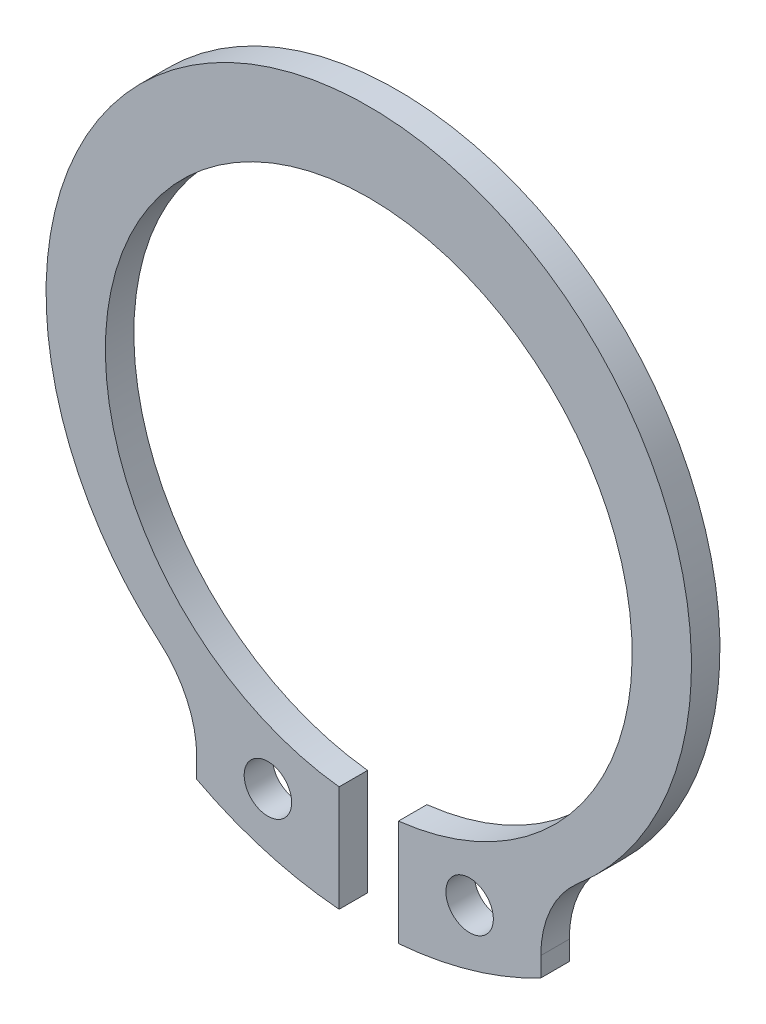
ISO-10303-21;
HEADER;
FILE_DESCRIPTION(('STEP AP214'),'2;1');
FILE_NAME('part.step','',(''),(''),'','','');
FILE_SCHEMA(('AUTOMOTIVE_DESIGN { 1 0 10303 214 1 1 1 1 }'));
ENDSEC;
DATA;
#1=APPLICATION_CONTEXT('core data for automotive mechanical design processes');
#2=APPLICATION_PROTOCOL_DEFINITION('international standard','automotive_design',2000,#1);
#3=PRODUCT_CONTEXT('',#1,'mechanical');
#4=PRODUCT('Part','Part','',(#3));
#5=PRODUCT_RELATED_PRODUCT_CATEGORY('part','',(#4));
#6=PRODUCT_DEFINITION_FORMATION('','',#4);
#7=PRODUCT_DEFINITION_CONTEXT('part definition',#1,'design');
#8=PRODUCT_DEFINITION('design','',#6,#7);
#9=PRODUCT_DEFINITION_SHAPE('','',#8);
#10=(LENGTH_UNIT() NAMED_UNIT(*) SI_UNIT(.MILLI.,.METRE.));
#11=(NAMED_UNIT(*) PLANE_ANGLE_UNIT() SI_UNIT($,.RADIAN.));
#12=(NAMED_UNIT(*) SI_UNIT($,.STERADIAN.) SOLID_ANGLE_UNIT());
#13=UNCERTAINTY_MEASURE_WITH_UNIT(LENGTH_MEASURE(1.E-05),#10,'distance_accuracy_value','');
#14=(GEOMETRIC_REPRESENTATION_CONTEXT(3) GLOBAL_UNCERTAINTY_ASSIGNED_CONTEXT((#13)) GLOBAL_UNIT_ASSIGNED_CONTEXT((#10,
#11,#12)) REPRESENTATION_CONTEXT('',''));
#15=CARTESIAN_POINT('',(0.,0.,0.));
#16=DIRECTION('',(0.,0.,1.));
#17=DIRECTION('',(1.,0.,0.));
#18=AXIS2_PLACEMENT_3D('',#15,#16,#17);
#19=CARTESIAN_POINT('',(0.,0.,-1.2));
#20=DIRECTION('',(0.,0.,1.));
#21=DIRECTION('',(1.,0.,0.));
#22=AXIS2_PLACEMENT_3D('',#19,#20,#21);
#23=CYLINDRICAL_SURFACE('',#22,13.6);
#24=CARTESIAN_POINT('',(0.,0.,-1.2));
#25=DIRECTION('',(0.,0.,1.));
#26=DIRECTION('',(1.,0.,0.));
#27=AXIS2_PLACEMENT_3D('',#24,#25,#26);
#28=CIRCLE('',#27,13.6);
#29=CARTESIAN_POINT('',(8.82872928176796,-10.3447348573684,-1.2));
#30=VERTEX_POINT('',#29);
#31=CARTESIAN_POINT('',(-8.82872928176796,-10.3447348573684,-1.2));
#32=VERTEX_POINT('',#31);
#33=EDGE_CURVE('E119',#30,#32,#28,.T.);
#34=ORIENTED_EDGE('',*,*,#33,.T.);
#35=DIRECTION('',(0.,0.,1.));
#36=VECTOR('',#35,1.);
#37=CARTESIAN_POINT('',(-8.82872928176796,-10.3447348573684,-1.2));
#38=LINE('',#37,#36);
#39=CARTESIAN_POINT('',(-8.82872928176796,-10.3447348573684,0.));
#40=VERTEX_POINT('',#39);
#41=EDGE_CURVE('E181',#32,#40,#38,.T.);
#42=ORIENTED_EDGE('',*,*,#41,.T.);
#43=CARTESIAN_POINT('',(0.,0.,0.));
#44=DIRECTION('',(0.,0.,1.));
#45=DIRECTION('',(1.,0.,0.));
#46=AXIS2_PLACEMENT_3D('',#43,#44,#45);
#47=CIRCLE('',#46,13.6);
#48=CARTESIAN_POINT('',(8.82872928176796,-10.3447348573684,0.));
#49=VERTEX_POINT('',#48);
#50=EDGE_CURVE('E148',#49,#40,#47,.T.);
#51=ORIENTED_EDGE('',*,*,#50,.F.);
#52=DIRECTION('',(0.,0.,1.));
#53=VECTOR('',#52,1.);
#54=CARTESIAN_POINT('',(8.82872928176796,-10.3447348573684,-1.2));
#55=LINE('',#54,#53);
#56=EDGE_CURVE('E172',#49,#30,#55,.F.);
#57=ORIENTED_EDGE('',*,*,#56,.T.);
#58=EDGE_LOOP('',(#34,#42,#51,#57));
#59=FACE_BOUND('',#58,.T.);
#60=ADVANCED_FACE('F31',(#59),#23,.T.);
#61=CARTESIAN_POINT('',(7.25,-11.5064112563388,-1.2));
#62=DIRECTION('',(1.,0.,0.));
#63=DIRECTION('',(0.,1.,0.));
#64=AXIS2_PLACEMENT_3D('',#61,#62,#63);
#65=PLANE('',#64);
#66=DIRECTION('',(0.,1.,0.));
#67=VECTOR('',#66,1.);
#68=CARTESIAN_POINT('',(7.25,-11.5064112563388,-1.2));
#69=LINE('',#68,#67);
#70=CARTESIAN_POINT('',(7.25000000000001,-14.5864530312141,-1.2));
#71=VERTEX_POINT('',#70);
#72=CARTESIAN_POINT('',(7.25,-13.7676250675271,-1.2));
#73=VERTEX_POINT('',#72);
#74=EDGE_CURVE('E127',#71,#73,#69,.T.);
#75=ORIENTED_EDGE('',*,*,#74,.T.);
#76=DIRECTION('',(0.,0.,-1.));
#77=VECTOR('',#76,1.);
#78=CARTESIAN_POINT('',(7.25,-13.7676250675271,0.));
#79=LINE('',#78,#77);
#80=CARTESIAN_POINT('',(7.25,-13.7676250675271,0.));
#81=VERTEX_POINT('',#80);
#82=EDGE_CURVE('E185',#73,#81,#79,.F.);
#83=ORIENTED_EDGE('',*,*,#82,.T.);
#84=DIRECTION('',(0.,1.,0.));
#85=VECTOR('',#84,1.);
#86=CARTESIAN_POINT('',(7.25,-11.5064112563388,0.));
#87=LINE('',#86,#85);
#88=CARTESIAN_POINT('',(7.25000000000001,-14.5864530312141,0.));
#89=VERTEX_POINT('',#88);
#90=EDGE_CURVE('E167',#89,#81,#87,.T.);
#91=ORIENTED_EDGE('',*,*,#90,.F.);
#92=DIRECTION('',(0.,0.,1.));
#93=VECTOR('',#92,1.);
#94=CARTESIAN_POINT('',(7.25000000000001,-14.5864530312141,-1.2));
#95=LINE('',#94,#93);
#96=EDGE_CURVE('E170',#71,#89,#95,.T.);
#97=ORIENTED_EDGE('',*,*,#96,.F.);
#98=EDGE_LOOP('',(#75,#83,#91,#97));
#99=FACE_BOUND('',#98,.T.);
#100=ADVANCED_FACE('F198',(#99),#65,.T.);
#101=CARTESIAN_POINT('',(0.,-0.83,-1.2));
#102=DIRECTION('',(0.,0.,1.));
#103=DIRECTION('',(1.,0.,0.));
#104=AXIS2_PLACEMENT_3D('',#101,#102,#103);
#105=CYLINDRICAL_SURFACE('',#104,15.55);
#106=CARTESIAN_POINT('',(0.,-0.83,0.));
#107=DIRECTION('',(0.,0.,1.));
#108=DIRECTION('',(-1.,0.,0.));
#109=AXIS2_PLACEMENT_3D('',#106,#107,#108);
#110=CIRCLE('',#109,15.55);
#111=CARTESIAN_POINT('',(1.25,-16.3296774159981,0.));
#112=VERTEX_POINT('',#111);
#113=EDGE_CURVE('E164',#112,#89,#110,.T.);
#114=ORIENTED_EDGE('',*,*,#113,.F.);
#115=DIRECTION('',(0.,0.,1.));
#116=VECTOR('',#115,1.);
#117=CARTESIAN_POINT('',(1.25,-16.3296774159981,-1.2));
#118=LINE('',#117,#116);
#119=CARTESIAN_POINT('',(1.25,-16.3296774159981,-1.2));
#120=VERTEX_POINT('',#119);
#121=EDGE_CURVE('E173',#120,#112,#118,.T.);
#122=ORIENTED_EDGE('',*,*,#121,.F.);
#123=CARTESIAN_POINT('',(0.,-0.83,-1.2));
#124=DIRECTION('',(0.,0.,1.));
#125=DIRECTION('',(-1.,0.,0.));
#126=AXIS2_PLACEMENT_3D('',#123,#124,#125);
#127=CIRCLE('',#126,15.55);
#128=EDGE_CURVE('E144',#120,#71,#127,.T.);
#129=ORIENTED_EDGE('',*,*,#128,.T.);
#130=ORIENTED_EDGE('',*,*,#96,.T.);
#131=EDGE_LOOP('',(#114,#122,#129,#130));
#132=FACE_BOUND('',#131,.T.);
#133=ADVANCED_FACE('F253',(#132),#105,.T.);
#134=CARTESIAN_POINT('',(1.25,-16.3296774159981,-1.2));
#135=DIRECTION('',(-1.,0.,0.));
#136=DIRECTION('',(0.,-1.,0.));
#137=AXIS2_PLACEMENT_3D('',#134,#135,#136);
#138=PLANE('',#137);
#139=DIRECTION('',(0.,-1.,0.));
#140=VECTOR('',#139,1.);
#141=CARTESIAN_POINT('',(1.25,-16.3296774159981,0.));
#142=LINE('',#141,#140);
#143=CARTESIAN_POINT('',(1.24999999999999,-11.8593925490029,0.));
#144=VERTEX_POINT('',#143);
#145=EDGE_CURVE('E161',#144,#112,#142,.T.);
#146=ORIENTED_EDGE('',*,*,#145,.F.);
#147=DIRECTION('',(0.,0.,1.));
#148=VECTOR('',#147,1.);
#149=CARTESIAN_POINT('',(1.24999999999999,-11.8593925490029,-1.2));
#150=LINE('',#149,#148);
#151=CARTESIAN_POINT('',(1.24999999999999,-11.8593925490029,-1.2));
#152=VERTEX_POINT('',#151);
#153=EDGE_CURVE('E175',#152,#144,#150,.T.);
#154=ORIENTED_EDGE('',*,*,#153,.F.);
#155=DIRECTION('',(0.,-1.,0.));
#156=VECTOR('',#155,1.);
#157=CARTESIAN_POINT('',(1.25,-16.3296774159981,-1.2));
#158=LINE('',#157,#156);
#159=EDGE_CURVE('E141',#152,#120,#158,.T.);
#160=ORIENTED_EDGE('',*,*,#159,.T.);
#161=ORIENTED_EDGE('',*,*,#121,.T.);
#162=EDGE_LOOP('',(#146,#154,#160,#161));
#163=FACE_BOUND('',#162,.T.);
#164=ADVANCED_FACE('F204',(#163),#138,.T.);
#165=CARTESIAN_POINT('',(0.,-0.83,-1.2));
#166=DIRECTION('',(0.,0.,1.));
#167=DIRECTION('',(1.,0.,0.));
#168=AXIS2_PLACEMENT_3D('',#165,#166,#167);
#169=CYLINDRICAL_SURFACE('',#168,11.1);
#170=CARTESIAN_POINT('',(0.,-0.83,0.));
#171=DIRECTION('',(0.,0.,-1.));
#172=DIRECTION('',(1.,0.,0.));
#173=AXIS2_PLACEMENT_3D('',#170,#171,#172);
#174=CIRCLE('',#173,11.1);
#175=CARTESIAN_POINT('',(-1.24999999999999,-11.8593925490029,0.));
#176=VERTEX_POINT('',#175);
#177=EDGE_CURVE('E158',#176,#144,#174,.T.);
#178=ORIENTED_EDGE('',*,*,#177,.F.);
#179=DIRECTION('',(0.,0.,1.));
#180=VECTOR('',#179,1.);
#181=CARTESIAN_POINT('',(-1.24999999999999,-11.8593925490029,-1.2));
#182=LINE('',#181,#180);
#183=CARTESIAN_POINT('',(-1.24999999999999,-11.8593925490029,-1.2));
#184=VERTEX_POINT('',#183);
#185=EDGE_CURVE('E177',#184,#176,#182,.T.);
#186=ORIENTED_EDGE('',*,*,#185,.F.);
#187=CARTESIAN_POINT('',(0.,-0.83,-1.2));
#188=DIRECTION('',(0.,0.,-1.));
#189=DIRECTION('',(1.,0.,0.));
#190=AXIS2_PLACEMENT_3D('',#187,#188,#189);
#191=CIRCLE('',#190,11.1);
#192=EDGE_CURVE('E135',#184,#152,#191,.T.);
#193=ORIENTED_EDGE('',*,*,#192,.T.);
#194=ORIENTED_EDGE('',*,*,#153,.T.);
#195=EDGE_LOOP('',(#178,#186,#193,#194));
#196=FACE_BOUND('',#195,.T.);
#197=ADVANCED_FACE('F208',(#196),#169,.F.);
#198=CARTESIAN_POINT('',(-1.24999999999999,-16.3296774159981,-1.2));
#199=DIRECTION('',(1.,0.,0.));
#200=DIRECTION('',(0.,0.,-1.));
#201=AXIS2_PLACEMENT_3D('',#198,#199,#200);
#202=PLANE('',#201);
#203=DIRECTION('',(0.,1.,0.));
#204=VECTOR('',#203,1.);
#205=CARTESIAN_POINT('',(-1.24999999999999,-16.3296774159981,0.));
#206=LINE('',#205,#204);
#207=CARTESIAN_POINT('',(-1.25,-16.3296774159981,0.));
#208=VERTEX_POINT('',#207);
#209=EDGE_CURVE('E155',#208,#176,#206,.T.);
#210=ORIENTED_EDGE('',*,*,#209,.F.);
#211=DIRECTION('',(0.,0.,1.));
#212=VECTOR('',#211,1.);
#213=CARTESIAN_POINT('',(-1.25,-16.3296774159981,-1.2));
#214=LINE('',#213,#212);
#215=CARTESIAN_POINT('',(-1.25,-16.3296774159981,-1.2));
#216=VERTEX_POINT('',#215);
#217=EDGE_CURVE('E126',#216,#208,#214,.T.);
#218=ORIENTED_EDGE('',*,*,#217,.F.);
#219=DIRECTION('',(0.,1.,0.));
#220=VECTOR('',#219,1.);
#221=CARTESIAN_POINT('',(-1.24999999999999,-16.3296774159981,-1.2));
#222=LINE('',#221,#220);
#223=EDGE_CURVE('E133',#216,#184,#222,.T.);
#224=ORIENTED_EDGE('',*,*,#223,.T.);
#225=ORIENTED_EDGE('',*,*,#185,.T.);
#226=EDGE_LOOP('',(#210,#218,#224,#225));
#227=FACE_BOUND('',#226,.T.);
#228=ADVANCED_FACE('F211',(#227),#202,.T.);
#229=CARTESIAN_POINT('',(0.,-0.83,-1.2));
#230=DIRECTION('',(0.,0.,1.));
#231=DIRECTION('',(1.,0.,0.));
#232=AXIS2_PLACEMENT_3D('',#229,#230,#231);
#233=CYLINDRICAL_SURFACE('',#232,15.55);
#234=CARTESIAN_POINT('',(0.,-0.83,0.));
#235=DIRECTION('',(0.,0.,1.));
#236=DIRECTION('',(1.,0.,0.));
#237=AXIS2_PLACEMENT_3D('',#234,#235,#236);
#238=CIRCLE('',#237,15.55);
#239=CARTESIAN_POINT('',(-7.25,-14.5864530312141,0.));
#240=VERTEX_POINT('',#239);
#241=EDGE_CURVE('E125',#240,#208,#238,.T.);
#242=ORIENTED_EDGE('',*,*,#241,.F.);
#243=DIRECTION('',(0.,0.,1.));
#244=VECTOR('',#243,1.);
#245=CARTESIAN_POINT('',(-7.25,-14.5864530312141,-1.2));
#246=LINE('',#245,#244);
#247=CARTESIAN_POINT('',(-7.25,-14.5864530312141,-1.2));
#248=VERTEX_POINT('',#247);
#249=EDGE_CURVE('E112',#248,#240,#246,.T.);
#250=ORIENTED_EDGE('',*,*,#249,.F.);
#251=CARTESIAN_POINT('',(0.,-0.83,-1.2));
#252=DIRECTION('',(0.,0.,1.));
#253=DIRECTION('',(1.,0.,0.));
#254=AXIS2_PLACEMENT_3D('',#251,#252,#253);
#255=CIRCLE('',#254,15.55);
#256=EDGE_CURVE('E118',#248,#216,#255,.T.);
#257=ORIENTED_EDGE('',*,*,#256,.T.);
#258=ORIENTED_EDGE('',*,*,#217,.T.);
#259=EDGE_LOOP('',(#242,#250,#257,#258));
#260=FACE_BOUND('',#259,.T.);
#261=ADVANCED_FACE('F123',(#260),#233,.T.);
#262=CARTESIAN_POINT('',(-7.25,-11.5064112563388,-1.2));
#263=DIRECTION('',(-1.,0.,0.));
#264=DIRECTION('',(0.,-1.,0.));
#265=AXIS2_PLACEMENT_3D('',#262,#263,#264);
#266=PLANE('',#265);
#267=DIRECTION('',(0.,-1.,0.));
#268=VECTOR('',#267,1.);
#269=CARTESIAN_POINT('',(-7.25,-11.5064112563388,0.));
#270=LINE('',#269,#268);
#271=CARTESIAN_POINT('',(-7.25,-13.7676250675271,0.));
#272=VERTEX_POINT('',#271);
#273=EDGE_CURVE('E151',#272,#240,#270,.T.);
#274=ORIENTED_EDGE('',*,*,#273,.F.);
#275=DIRECTION('',(0.,0.,-1.));
#276=VECTOR('',#275,1.);
#277=CARTESIAN_POINT('',(-7.25,-13.7676250675271,-1.2));
#278=LINE('',#277,#276);
#279=CARTESIAN_POINT('',(-7.25,-13.7676250675271,-1.2));
#280=VERTEX_POINT('',#279);
#281=EDGE_CURVE('E115',#272,#280,#278,.T.);
#282=ORIENTED_EDGE('',*,*,#281,.T.);
#283=DIRECTION('',(0.,-1.,0.));
#284=VECTOR('',#283,1.);
#285=CARTESIAN_POINT('',(-7.25,-11.5064112563388,-1.2));
#286=LINE('',#285,#284);
#287=EDGE_CURVE('E108',#280,#248,#286,.T.);
#288=ORIENTED_EDGE('',*,*,#287,.T.);
#289=ORIENTED_EDGE('',*,*,#249,.T.);
#290=EDGE_LOOP('',(#274,#282,#288,#289));
#291=FACE_BOUND('',#290,.T.);
#292=ADVANCED_FACE('F111',(#291),#266,.T.);
#293=CARTESIAN_POINT('',(0.,0.,-1.2));
#294=DIRECTION('',(0.,0.,1.));
#295=DIRECTION('',(1.,0.,0.));
#296=AXIS2_PLACEMENT_3D('',#293,#294,#295);
#297=PLANE('',#296);
#298=CARTESIAN_POINT('',(4.25,-13.432678286777,-1.2));
#299=DIRECTION('',(0.,0.,1.));
#300=DIRECTION('',(-1.,0.,0.));
#301=AXIS2_PLACEMENT_3D('',#298,#299,#300);
#302=CIRCLE('',#301,0.999999999999998);
#303=CARTESIAN_POINT('',(3.25,-13.432678286777,-1.2));
#304=VERTEX_POINT('',#303);
#305=EDGE_CURVE('E218',#304,#304,#302,.T.);
#306=ORIENTED_EDGE('',*,*,#305,.T.);
#307=EDGE_LOOP('',(#306));
#308=FACE_BOUND('',#307,.T.);
#309=CARTESIAN_POINT('',(-4.25,-13.432678286777,-1.2));
#310=DIRECTION('',(0.,0.,1.));
#311=DIRECTION('',(1.,0.,0.));
#312=AXIS2_PLACEMENT_3D('',#309,#310,#311);
#313=CIRCLE('',#312,1.);
#314=CARTESIAN_POINT('',(-3.25,-13.432678286777,-1.2));
#315=VERTEX_POINT('',#314);
#316=EDGE_CURVE('E152',#315,#315,#313,.T.);
#317=ORIENTED_EDGE('',*,*,#316,.T.);
#318=EDGE_LOOP('',(#317));
#319=FACE_BOUND('',#318,.T.);
#320=ORIENTED_EDGE('',*,*,#33,.F.);
#321=CARTESIAN_POINT('',(11.75,-13.7676250675271,-1.2));
#322=DIRECTION('',(0.,0.,1.));
#323=DIRECTION('',(1.,0.,0.));
#324=AXIS2_PLACEMENT_3D('',#321,#322,#323);
#325=CIRCLE('',#324,4.5);
#326=EDGE_CURVE('E11',#30,#73,#325,.T.);
#327=ORIENTED_EDGE('',*,*,#326,.T.);
#328=ORIENTED_EDGE('',*,*,#74,.F.);
#329=ORIENTED_EDGE('',*,*,#128,.F.);
#330=ORIENTED_EDGE('',*,*,#159,.F.);
#331=ORIENTED_EDGE('',*,*,#192,.F.);
#332=ORIENTED_EDGE('',*,*,#223,.F.);
#333=ORIENTED_EDGE('',*,*,#256,.F.);
#334=ORIENTED_EDGE('',*,*,#287,.F.);
#335=CARTESIAN_POINT('',(-11.75,-13.7676250675271,-1.2));
#336=DIRECTION('',(0.,0.,1.));
#337=DIRECTION('',(1.,0.,0.));
#338=AXIS2_PLACEMENT_3D('',#335,#336,#337);
#339=CIRCLE('',#338,4.5);
#340=EDGE_CURVE('E189',#280,#32,#339,.T.);
#341=ORIENTED_EDGE('',*,*,#340,.T.);
#342=EDGE_LOOP('',(#320,#327,#328,#329,#330,#331,#332,#333,#334,#341));
#343=FACE_BOUND('',#342,.T.);
#344=ADVANCED_FACE('F130',(#308,#319,#343),#297,.F.);
#345=CARTESIAN_POINT('',(0.,0.,0.));
#346=DIRECTION('',(0.,0.,1.));
#347=DIRECTION('',(1.,0.,0.));
#348=AXIS2_PLACEMENT_3D('',#345,#346,#347);
#349=PLANE('',#348);
#350=CARTESIAN_POINT('',(4.25,-13.432678286777,0.));
#351=DIRECTION('',(0.,0.,1.));
#352=DIRECTION('',(-1.,0.,0.));
#353=AXIS2_PLACEMENT_3D('',#350,#351,#352);
#354=CIRCLE('',#353,0.999999999999998);
#355=CARTESIAN_POINT('',(3.25,-13.432678286777,0.));
#356=VERTEX_POINT('',#355);
#357=EDGE_CURVE('E221',#356,#356,#354,.T.);
#358=ORIENTED_EDGE('',*,*,#357,.F.);
#359=EDGE_LOOP('',(#358));
#360=FACE_BOUND('',#359,.T.);
#361=CARTESIAN_POINT('',(-4.25,-13.432678286777,0.));
#362=DIRECTION('',(0.,0.,1.));
#363=DIRECTION('',(1.,0.,0.));
#364=AXIS2_PLACEMENT_3D('',#361,#362,#363);
#365=CIRCLE('',#364,1.);
#366=CARTESIAN_POINT('',(-3.25,-13.432678286777,0.));
#367=VERTEX_POINT('',#366);
#368=EDGE_CURVE('E215',#367,#367,#365,.T.);
#369=ORIENTED_EDGE('',*,*,#368,.F.);
#370=EDGE_LOOP('',(#369));
#371=FACE_BOUND('',#370,.T.);
#372=ORIENTED_EDGE('',*,*,#90,.T.);
#373=CARTESIAN_POINT('',(11.75,-13.7676250675271,0.));
#374=DIRECTION('',(0.,0.,1.));
#375=DIRECTION('',(1.,0.,0.));
#376=AXIS2_PLACEMENT_3D('',#373,#374,#375);
#377=CIRCLE('',#376,4.5);
#378=EDGE_CURVE('E39',#81,#49,#377,.F.);
#379=ORIENTED_EDGE('',*,*,#378,.T.);
#380=ORIENTED_EDGE('',*,*,#50,.T.);
#381=CARTESIAN_POINT('',(-11.75,-13.7676250675271,0.));
#382=DIRECTION('',(0.,0.,1.));
#383=DIRECTION('',(1.,0.,0.));
#384=AXIS2_PLACEMENT_3D('',#381,#382,#383);
#385=CIRCLE('',#384,4.5);
#386=EDGE_CURVE('E187',#40,#272,#385,.F.);
#387=ORIENTED_EDGE('',*,*,#386,.T.);
#388=ORIENTED_EDGE('',*,*,#273,.T.);
#389=ORIENTED_EDGE('',*,*,#241,.T.);
#390=ORIENTED_EDGE('',*,*,#209,.T.);
#391=ORIENTED_EDGE('',*,*,#177,.T.);
#392=ORIENTED_EDGE('',*,*,#145,.T.);
#393=ORIENTED_EDGE('',*,*,#113,.T.);
#394=EDGE_LOOP('',(#372,#379,#380,#387,#388,#389,#390,#391,#392,#393));
#395=FACE_BOUND('',#394,.T.);
#396=ADVANCED_FACE('F192',(#360,#371,#395),#349,.T.);
#397=CARTESIAN_POINT('',(-4.25,-13.432678286777,-1.2));
#398=DIRECTION('',(0.,0.,1.));
#399=DIRECTION('',(1.,0.,0.));
#400=AXIS2_PLACEMENT_3D('',#397,#398,#399);
#401=CYLINDRICAL_SURFACE('',#400,1.);
#402=ORIENTED_EDGE('',*,*,#316,.F.);
#403=EDGE_LOOP('',(#402));
#404=FACE_BOUND('',#403,.T.);
#405=ORIENTED_EDGE('',*,*,#368,.T.);
#406=EDGE_LOOP('',(#405));
#407=FACE_BOUND('',#406,.T.);
#408=ADVANCED_FACE('F232',(#404,#407),#401,.F.);
#409=CARTESIAN_POINT('',(4.25,-13.432678286777,-1.2));
#410=DIRECTION('',(0.,0.,1.));
#411=DIRECTION('',(1.,0.,0.));
#412=AXIS2_PLACEMENT_3D('',#409,#410,#411);
#413=CYLINDRICAL_SURFACE('',#412,0.999999999999998);
#414=ORIENTED_EDGE('',*,*,#305,.F.);
#415=EDGE_LOOP('',(#414));
#416=FACE_BOUND('',#415,.T.);
#417=ORIENTED_EDGE('',*,*,#357,.T.);
#418=EDGE_LOOP('',(#417));
#419=FACE_BOUND('',#418,.T.);
#420=ADVANCED_FACE('F229',(#416,#419),#413,.F.);
#421=CARTESIAN_POINT('',(-11.75,-13.7676250675271,-1.2));
#422=DIRECTION('',(0.,0.,1.));
#423=DIRECTION('',(1.,0.,0.));
#424=AXIS2_PLACEMENT_3D('',#421,#422,#423);
#425=CYLINDRICAL_SURFACE('',#424,4.5);
#426=ORIENTED_EDGE('',*,*,#340,.F.);
#427=ORIENTED_EDGE('',*,*,#281,.F.);
#428=ORIENTED_EDGE('',*,*,#386,.F.);
#429=ORIENTED_EDGE('',*,*,#41,.F.);
#430=EDGE_LOOP('',(#426,#427,#428,#429));
#431=FACE_BOUND('',#430,.T.);
#432=ADVANCED_FACE('F213',(#431),#425,.F.);
#433=CARTESIAN_POINT('',(11.75,-13.7676250675271,-1.2));
#434=DIRECTION('',(0.,0.,1.));
#435=DIRECTION('',(1.,0.,0.));
#436=AXIS2_PLACEMENT_3D('',#433,#434,#435);
#437=CYLINDRICAL_SURFACE('',#436,4.5);
#438=ORIENTED_EDGE('',*,*,#326,.F.);
#439=ORIENTED_EDGE('',*,*,#56,.F.);
#440=ORIENTED_EDGE('',*,*,#378,.F.);
#441=ORIENTED_EDGE('',*,*,#82,.F.);
#442=EDGE_LOOP('',(#438,#439,#440,#441));
#443=FACE_BOUND('',#442,.T.);
#444=ADVANCED_FACE('F33',(#443),#437,.F.);
#445=CLOSED_SHELL('',(#60,#100,#133,#164,#197,#228,#261,#292,#344,#396,#408,#420,#432,#444));
#446=MANIFOLD_SOLID_BREP('B2',#445);
#447=ADVANCED_BREP_SHAPE_REPRESENTATION('',(#18,#446),#14);
#448=SHAPE_DEFINITION_REPRESENTATION(#9,#447);
ENDSEC;
END-ISO-10303-21;
